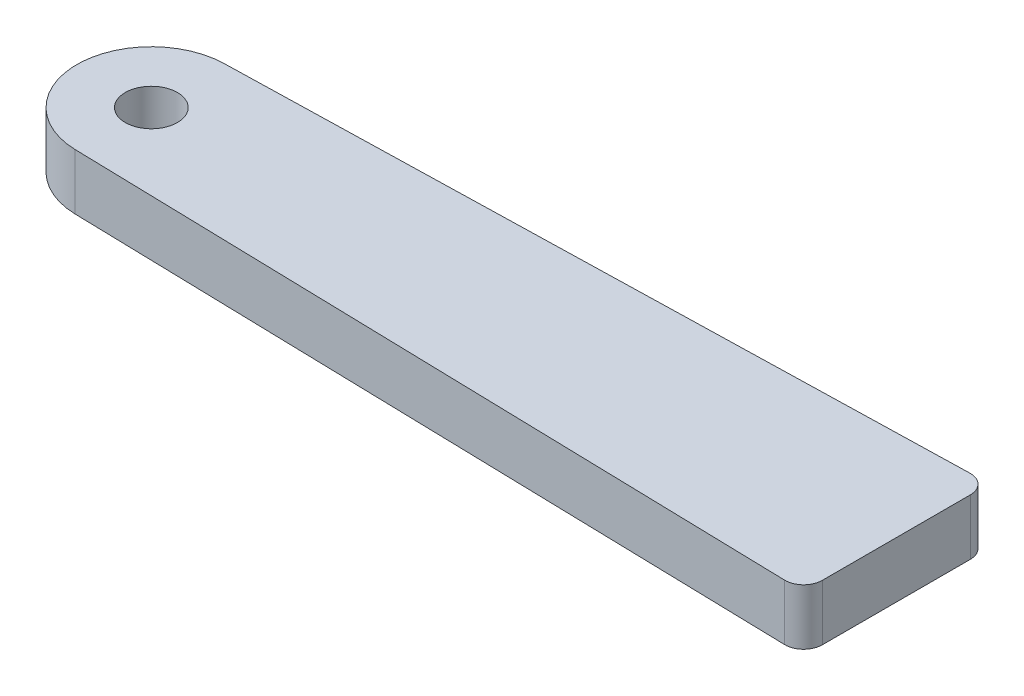
ISO-10303-21;
HEADER;
FILE_DESCRIPTION(('STEP AP214'),'2;1');
FILE_NAME('part.step','',(''),(''),'','','');
FILE_SCHEMA(('AUTOMOTIVE_DESIGN { 1 0 10303 214 1 1 1 1 }'));
ENDSEC;
DATA;
#1=APPLICATION_CONTEXT('core data for automotive mechanical design processes');
#2=APPLICATION_PROTOCOL_DEFINITION('international standard','automotive_design',2000,#1);
#3=PRODUCT_CONTEXT('',#1,'mechanical');
#4=PRODUCT('Part','Part','',(#3));
#5=PRODUCT_RELATED_PRODUCT_CATEGORY('part','',(#4));
#6=PRODUCT_DEFINITION_FORMATION('','',#4);
#7=PRODUCT_DEFINITION_CONTEXT('part definition',#1,'design');
#8=PRODUCT_DEFINITION('design','',#6,#7);
#9=PRODUCT_DEFINITION_SHAPE('','',#8);
#10=(LENGTH_UNIT() NAMED_UNIT(*) SI_UNIT(.MILLI.,.METRE.));
#11=(NAMED_UNIT(*) PLANE_ANGLE_UNIT() SI_UNIT($,.RADIAN.));
#12=(NAMED_UNIT(*) SI_UNIT($,.STERADIAN.) SOLID_ANGLE_UNIT());
#13=UNCERTAINTY_MEASURE_WITH_UNIT(LENGTH_MEASURE(1.E-05),#10,'distance_accuracy_value','');
#14=(GEOMETRIC_REPRESENTATION_CONTEXT(3) GLOBAL_UNCERTAINTY_ASSIGNED_CONTEXT((#13)) GLOBAL_UNIT_ASSIGNED_CONTEXT((#10,
#11,#12)) REPRESENTATION_CONTEXT('',''));
#15=CARTESIAN_POINT('',(0.,0.,0.));
#16=DIRECTION('',(0.,0.,1.));
#17=DIRECTION('',(1.,0.,0.));
#18=AXIS2_PLACEMENT_3D('',#15,#16,#17);
#19=CARTESIAN_POINT('',(0.,3.,0.));
#20=DIRECTION('',(1.,0.,0.));
#21=DIRECTION('',(0.,0.,-1.));
#22=AXIS2_PLACEMENT_3D('',#19,#20,#21);
#23=PLANE('',#22);
#24=DIRECTION('',(0.,0.,1.));
#25=VECTOR('',#24,1.);
#26=CARTESIAN_POINT('',(0.,0.,0.));
#27=LINE('',#26,#25);
#28=CARTESIAN_POINT('',(0.,0.,1.02527845548114));
#29=VERTEX_POINT('',#28);
#30=CARTESIAN_POINT('',(0.,0.,8.97473488294553));
#31=VERTEX_POINT('',#30);
#32=EDGE_CURVE('E130',#29,#31,#27,.T.);
#33=ORIENTED_EDGE('',*,*,#32,.F.);
#34=DIRECTION('',(0.,-1.,0.));
#35=VECTOR('',#34,1.);
#36=CARTESIAN_POINT('',(0.,3.,1.02527845548114));
#37=LINE('',#36,#35);
#38=CARTESIAN_POINT('',(0.,3.,1.02527845548114));
#39=VERTEX_POINT('',#38);
#40=EDGE_CURVE('E11',#39,#29,#37,.T.);
#41=ORIENTED_EDGE('',*,*,#40,.F.);
#42=DIRECTION('',(0.,0.,1.));
#43=VECTOR('',#42,1.);
#44=CARTESIAN_POINT('',(0.,3.,0.));
#45=LINE('',#44,#43);
#46=CARTESIAN_POINT('',(0.,3.,8.97473488294553));
#47=VERTEX_POINT('',#46);
#48=EDGE_CURVE('E192',#39,#47,#45,.T.);
#49=ORIENTED_EDGE('',*,*,#48,.T.);
#50=DIRECTION('',(0.,-1.,0.));
#51=VECTOR('',#50,1.);
#52=CARTESIAN_POINT('',(0.,3.,8.97473488294553));
#53=LINE('',#52,#51);
#54=EDGE_CURVE('E85',#47,#31,#53,.T.);
#55=ORIENTED_EDGE('',*,*,#54,.T.);
#56=EDGE_LOOP('',(#33,#41,#49,#55));
#57=FACE_BOUND('',#56,.T.);
#58=ADVANCED_FACE('F39',(#57),#23,.T.);
#59=CARTESIAN_POINT('',(-1.,3.,1.02527845548114));
#60=DIRECTION('',(0.,-1.,0.));
#61=DIRECTION('',(0.,0.,-1.));
#62=AXIS2_PLACEMENT_3D('',#59,#60,#61);
#63=CYLINDRICAL_SURFACE('',#62,1.);
#64=CARTESIAN_POINT('',(-1.,0.,1.02527845548114));
#65=DIRECTION('',(0.,1.,0.));
#66=DIRECTION('',(0.,0.,1.));
#67=AXIS2_PLACEMENT_3D('',#64,#65,#66);
#68=CIRCLE('',#67,1.);
#69=CARTESIAN_POINT('',(-1.02495905485791,0.,0.025589981214978));
#70=VERTEX_POINT('',#69);
#71=EDGE_CURVE('E134',#29,#70,#68,.T.);
#72=ORIENTED_EDGE('',*,*,#71,.T.);
#73=DIRECTION('',(0.,-1.,0.));
#74=VECTOR('',#73,1.);
#75=CARTESIAN_POINT('',(-1.02495905485791,3.,0.025589981214978));
#76=LINE('',#75,#74);
#77=CARTESIAN_POINT('',(-1.02495905485791,3.,0.025589981214978));
#78=VERTEX_POINT('',#77);
#79=EDGE_CURVE('E49',#78,#70,#76,.T.);
#80=ORIENTED_EDGE('',*,*,#79,.F.);
#81=CARTESIAN_POINT('',(-1.,3.,1.02527845548114));
#82=DIRECTION('',(0.,1.,0.));
#83=DIRECTION('',(0.,0.,1.));
#84=AXIS2_PLACEMENT_3D('',#81,#82,#83);
#85=CIRCLE('',#84,1.);
#86=EDGE_CURVE('E195',#39,#78,#85,.T.);
#87=ORIENTED_EDGE('',*,*,#86,.F.);
#88=ORIENTED_EDGE('',*,*,#40,.T.);
#89=EDGE_LOOP('',(#72,#80,#87,#88));
#90=FACE_BOUND('',#89,.T.);
#91=ADVANCED_FACE('F163',(#90),#63,.T.);
#92=CARTESIAN_POINT('',(0.,3.,0.));
#93=DIRECTION('',(0.0249590548579011,0.,0.999688474266159));
#94=DIRECTION('',(0.999688474266159,0.,-0.0249590548579011));
#95=AXIS2_PLACEMENT_3D('',#92,#93,#94);
#96=PLANE('',#95);
#97=DIRECTION('',(-0.999688474266159,0.,0.0249590548579011));
#98=VECTOR('',#97,1.);
#99=CARTESIAN_POINT('',(0.,0.,0.));
#100=LINE('',#99,#98);
#101=CARTESIAN_POINT('',(-40.0998707315663,0.,1.00116676259432));
#102=VERTEX_POINT('',#101);
#103=EDGE_CURVE('E138',#70,#102,#100,.T.);
#104=ORIENTED_EDGE('',*,*,#103,.T.);
#105=DIRECTION('',(0.,-1.,0.));
#106=VECTOR('',#105,1.);
#107=CARTESIAN_POINT('',(-40.0998707315663,3.,1.00116676259432));
#108=LINE('',#107,#106);
#109=CARTESIAN_POINT('',(-40.0998707315663,3.,1.00116676259432));
#110=VERTEX_POINT('',#109);
#111=EDGE_CURVE('E117',#110,#102,#108,.T.);
#112=ORIENTED_EDGE('',*,*,#111,.F.);
#113=DIRECTION('',(-0.999688474266159,0.,0.0249590548579011));
#114=VECTOR('',#113,1.);
#115=CARTESIAN_POINT('',(0.,3.,0.));
#116=LINE('',#115,#114);
#117=EDGE_CURVE('E103',#78,#110,#116,.T.);
#118=ORIENTED_EDGE('',*,*,#117,.F.);
#119=ORIENTED_EDGE('',*,*,#79,.T.);
#120=EDGE_LOOP('',(#104,#112,#118,#119));
#121=FACE_BOUND('',#120,.T.);
#122=ADVANCED_FACE('F160',(#121),#96,.F.);
#123=CARTESIAN_POINT('',(-40.0000260168191,3.,5.00026092370631));
#124=DIRECTION('',(0.,-1.,0.));
#125=DIRECTION('',(0.,0.,-1.));
#126=AXIS2_PLACEMENT_3D('',#123,#124,#125);
#127=CYLINDRICAL_SURFACE('',#126,4.0003403700814);
#128=CARTESIAN_POINT('',(-40.0000260168191,0.,5.00026092370631));
#129=DIRECTION('',(0.,1.,0.));
#130=DIRECTION('',(0.,0.,1.));
#131=AXIS2_PLACEMENT_3D('',#128,#129,#130);
#132=CIRCLE('',#131,4.0003403700814);
#133=CARTESIAN_POINT('',(-40.0998187209434,0.,8.9993563830204));
#134=VERTEX_POINT('',#133);
#135=EDGE_CURVE('E112',#102,#134,#132,.T.);
#136=ORIENTED_EDGE('',*,*,#135,.T.);
#137=DIRECTION('',(0.,-1.,0.));
#138=VECTOR('',#137,1.);
#139=CARTESIAN_POINT('',(-40.0998187209434,3.,8.9993563830204));
#140=LINE('',#139,#138);
#141=CARTESIAN_POINT('',(-40.0998187209434,3.,8.9993563830204));
#142=VERTEX_POINT('',#141);
#143=EDGE_CURVE('E110',#142,#134,#140,.T.);
#144=ORIENTED_EDGE('',*,*,#143,.F.);
#145=CARTESIAN_POINT('',(-40.0000260168191,3.,5.00026092370631));
#146=DIRECTION('',(0.,1.,0.));
#147=DIRECTION('',(0.,0.,1.));
#148=AXIS2_PLACEMENT_3D('',#145,#146,#147);
#149=CIRCLE('',#148,4.0003403700814);
#150=EDGE_CURVE('E97',#110,#142,#149,.T.);
#151=ORIENTED_EDGE('',*,*,#150,.F.);
#152=ORIENTED_EDGE('',*,*,#111,.T.);
#153=EDGE_LOOP('',(#136,#144,#151,#152));
#154=FACE_BOUND('',#153,.T.);
#155=ADVANCED_FACE('F111',(#154),#127,.T.);
#156=CARTESIAN_POINT('',(-0.249382900665135,3.,9.99377694424329));
#157=DIRECTION('',(-0.0249460533085111,0.,0.999688798789068));
#158=DIRECTION('',(0.999688798789068,0.,0.0249460533085111));
#159=AXIS2_PLACEMENT_3D('',#156,#157,#158);
#160=PLANE('',#159);
#161=DIRECTION('',(-0.999688798789068,0.,-0.0249460533085111));
#162=VECTOR('',#161,1.);
#163=CARTESIAN_POINT('',(-0.249382900665135,0.,9.99377694424329));
#164=LINE('',#163,#162);
#165=CARTESIAN_POINT('',(-1.02494605330852,0.,9.9744236817346));
#166=VERTEX_POINT('',#165);
#167=EDGE_CURVE('E144',#166,#134,#164,.T.);
#168=ORIENTED_EDGE('',*,*,#167,.F.);
#169=DIRECTION('',(0.,-1.,0.));
#170=VECTOR('',#169,1.);
#171=CARTESIAN_POINT('',(-1.02494605330852,3.,9.9744236817346));
#172=LINE('',#171,#170);
#173=CARTESIAN_POINT('',(-1.02494605330852,3.,9.9744236817346));
#174=VERTEX_POINT('',#173);
#175=EDGE_CURVE('E78',#174,#166,#172,.T.);
#176=ORIENTED_EDGE('',*,*,#175,.F.);
#177=DIRECTION('',(-0.999688798789068,0.,-0.0249460533085111));
#178=VECTOR('',#177,1.);
#179=CARTESIAN_POINT('',(-0.249382900665135,3.,9.99377694424329));
#180=LINE('',#179,#178);
#181=EDGE_CURVE('E101',#174,#142,#180,.T.);
#182=ORIENTED_EDGE('',*,*,#181,.T.);
#183=ORIENTED_EDGE('',*,*,#143,.T.);
#184=EDGE_LOOP('',(#168,#176,#182,#183));
#185=FACE_BOUND('',#184,.T.);
#186=ADVANCED_FACE('F119',(#185),#160,.T.);
#187=CARTESIAN_POINT('',(-40.0000260168191,3.,5.00026092370631));
#188=DIRECTION('',(0.,-1.,0.));
#189=DIRECTION('',(0.,0.,-1.));
#190=AXIS2_PLACEMENT_3D('',#187,#188,#189);
#191=CYLINDRICAL_SURFACE('',#190,1.4);
#192=CARTESIAN_POINT('',(-40.0000260168191,3.,5.00026092370631));
#193=DIRECTION('',(0.,1.,0.));
#194=DIRECTION('',(0.,0.,1.));
#195=AXIS2_PLACEMENT_3D('',#192,#193,#194);
#196=CIRCLE('',#195,1.4);
#197=CARTESIAN_POINT('',(-40.0000260168191,3.,6.40026092370631));
#198=VERTEX_POINT('',#197);
#199=EDGE_CURVE('E150',#198,#198,#196,.T.);
#200=ORIENTED_EDGE('',*,*,#199,.T.);
#201=EDGE_LOOP('',(#200));
#202=FACE_BOUND('',#201,.T.);
#203=CARTESIAN_POINT('',(-40.0000260168191,0.,5.00026092370631));
#204=DIRECTION('',(0.,1.,0.));
#205=DIRECTION('',(0.,0.,1.));
#206=AXIS2_PLACEMENT_3D('',#203,#204,#205);
#207=CIRCLE('',#206,1.4);
#208=CARTESIAN_POINT('',(-40.0000260168191,0.,6.40026092370631));
#209=VERTEX_POINT('',#208);
#210=EDGE_CURVE('E126',#209,#209,#207,.T.);
#211=ORIENTED_EDGE('',*,*,#210,.F.);
#212=EDGE_LOOP('',(#211));
#213=FACE_BOUND('',#212,.T.);
#214=ADVANCED_FACE('F41',(#202,#213),#191,.F.);
#215=CARTESIAN_POINT('',(-0.999999999999999,3.,8.97473488294553));
#216=DIRECTION('',(0.,-1.,0.));
#217=DIRECTION('',(0.,0.,-1.));
#218=AXIS2_PLACEMENT_3D('',#215,#216,#217);
#219=CYLINDRICAL_SURFACE('',#218,1.);
#220=CARTESIAN_POINT('',(-0.999999999999999,0.,8.97473488294553));
#221=DIRECTION('',(0.,1.,0.));
#222=DIRECTION('',(0.,0.,1.));
#223=AXIS2_PLACEMENT_3D('',#220,#221,#222);
#224=CIRCLE('',#223,1.);
#225=EDGE_CURVE('E147',#166,#31,#224,.T.);
#226=ORIENTED_EDGE('',*,*,#225,.T.);
#227=ORIENTED_EDGE('',*,*,#54,.F.);
#228=CARTESIAN_POINT('',(-0.999999999999999,3.,8.97473488294553));
#229=DIRECTION('',(0.,1.,0.));
#230=DIRECTION('',(0.,0.,1.));
#231=AXIS2_PLACEMENT_3D('',#228,#229,#230);
#232=CIRCLE('',#231,1.);
#233=EDGE_CURVE('E57',#174,#47,#232,.T.);
#234=ORIENTED_EDGE('',*,*,#233,.F.);
#235=ORIENTED_EDGE('',*,*,#175,.T.);
#236=EDGE_LOOP('',(#226,#227,#234,#235));
#237=FACE_BOUND('',#236,.T.);
#238=ADVANCED_FACE('F178',(#237),#219,.T.);
#239=CARTESIAN_POINT('',(0.,3.,0.));
#240=DIRECTION('',(0.,1.,0.));
#241=DIRECTION('',(0.,0.,1.));
#242=AXIS2_PLACEMENT_3D('',#239,#240,#241);
#243=PLANE('',#242);
#244=ORIENTED_EDGE('',*,*,#199,.F.);
#245=EDGE_LOOP('',(#244));
#246=FACE_BOUND('',#245,.T.);
#247=ORIENTED_EDGE('',*,*,#48,.F.);
#248=ORIENTED_EDGE('',*,*,#86,.T.);
#249=ORIENTED_EDGE('',*,*,#117,.T.);
#250=ORIENTED_EDGE('',*,*,#150,.T.);
#251=ORIENTED_EDGE('',*,*,#181,.F.);
#252=ORIENTED_EDGE('',*,*,#233,.T.);
#253=EDGE_LOOP('',(#247,#248,#249,#250,#251,#252));
#254=FACE_BOUND('',#253,.T.);
#255=ADVANCED_FACE('F99',(#246,#254),#243,.T.);
#256=CARTESIAN_POINT('',(0.,0.,0.));
#257=DIRECTION('',(0.,1.,0.));
#258=DIRECTION('',(0.,0.,1.));
#259=AXIS2_PLACEMENT_3D('',#256,#257,#258);
#260=PLANE('',#259);
#261=ORIENTED_EDGE('',*,*,#210,.T.);
#262=EDGE_LOOP('',(#261));
#263=FACE_BOUND('',#262,.T.);
#264=ORIENTED_EDGE('',*,*,#32,.T.);
#265=ORIENTED_EDGE('',*,*,#225,.F.);
#266=ORIENTED_EDGE('',*,*,#167,.T.);
#267=ORIENTED_EDGE('',*,*,#135,.F.);
#268=ORIENTED_EDGE('',*,*,#103,.F.);
#269=ORIENTED_EDGE('',*,*,#71,.F.);
#270=EDGE_LOOP('',(#264,#265,#266,#267,#268,#269));
#271=FACE_BOUND('',#270,.T.);
#272=ADVANCED_FACE('F165',(#263,#271),#260,.F.);
#273=CLOSED_SHELL('',(#58,#91,#122,#155,#186,#214,#238,#255,#272));
#274=MANIFOLD_SOLID_BREP('B2',#273);
#275=ADVANCED_BREP_SHAPE_REPRESENTATION('',(#18,#274),#14);
#276=SHAPE_DEFINITION_REPRESENTATION(#9,#275);
ENDSEC;
END-ISO-10303-21;
